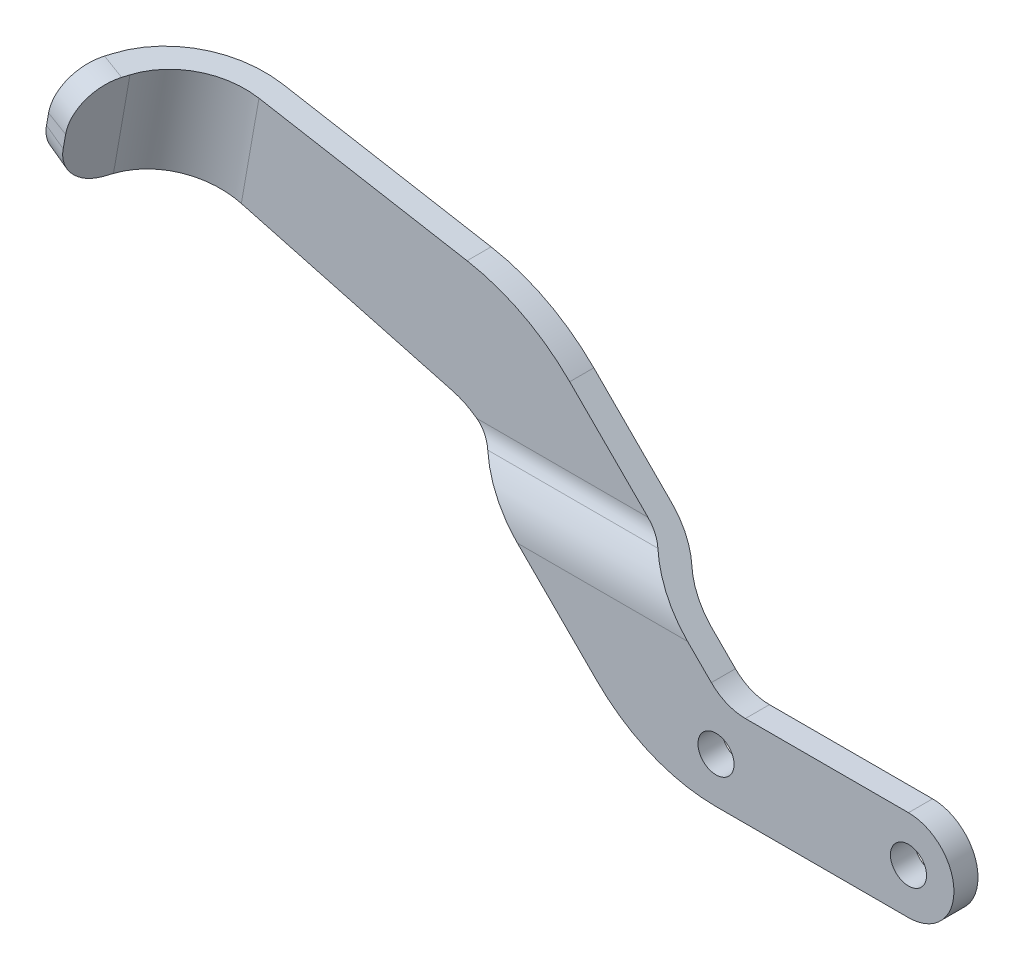
ISO-10303-21;
HEADER;
FILE_DESCRIPTION(('STEP AP214'),'2;1');
FILE_NAME('part.step','',(''),(''),'','','');
FILE_SCHEMA(('AUTOMOTIVE_DESIGN { 1 0 10303 214 1 1 1 1 }'));
ENDSEC;
DATA;
#1=APPLICATION_CONTEXT('core data for automotive mechanical design processes');
#2=APPLICATION_PROTOCOL_DEFINITION('international standard','automotive_design',2000,#1);
#3=PRODUCT_CONTEXT('',#1,'mechanical');
#4=PRODUCT('Part','Part','',(#3));
#5=PRODUCT_RELATED_PRODUCT_CATEGORY('part','',(#4));
#6=PRODUCT_DEFINITION_FORMATION('','',#4);
#7=PRODUCT_DEFINITION_CONTEXT('part definition',#1,'design');
#8=PRODUCT_DEFINITION('design','',#6,#7);
#9=PRODUCT_DEFINITION_SHAPE('','',#8);
#10=(LENGTH_UNIT() NAMED_UNIT(*) SI_UNIT(.MILLI.,.METRE.));
#11=(NAMED_UNIT(*) PLANE_ANGLE_UNIT() SI_UNIT($,.RADIAN.));
#12=(NAMED_UNIT(*) SI_UNIT($,.STERADIAN.) SOLID_ANGLE_UNIT());
#13=UNCERTAINTY_MEASURE_WITH_UNIT(LENGTH_MEASURE(1.E-05),#10,'distance_accuracy_value','');
#14=(GEOMETRIC_REPRESENTATION_CONTEXT(3) GLOBAL_UNCERTAINTY_ASSIGNED_CONTEXT((#13)) GLOBAL_UNIT_ASSIGNED_CONTEXT((#10,
#11,#12)) REPRESENTATION_CONTEXT('',''));
#15=CARTESIAN_POINT('',(0.,0.,0.));
#16=DIRECTION('',(0.,0.,1.));
#17=DIRECTION('',(1.,0.,0.));
#18=AXIS2_PLACEMENT_3D('',#15,#16,#17);
#19=CARTESIAN_POINT('',(-26.0151280605346,7.85987193946543,3.175));
#20=DIRECTION('',(-0.707106781186549,-0.707106781186546,0.));
#21=DIRECTION('',(0.707106781186546,-0.707106781186549,0.));
#22=AXIS2_PLACEMENT_3D('',#19,#20,#21);
#23=PLANE('',#22);
#24=CARTESIAN_POINT('',(-29.1549957084391,10.9997395873699,-6.35));
#25=DIRECTION('',(-0.707106781186549,-0.707106781186546,0.));
#26=DIRECTION('',(0.707106781186546,-0.707106781186549,0.));
#27=AXIS2_PLACEMENT_3D('',#24,#25,#26);
#28=ELLIPSE('',#27,13.4703841816037,9.525);
#29=CARTESIAN_POINT('',(-29.1549957084391,10.9997395873699,3.175));
#30=VERTEX_POINT('',#29);
#31=CARTESIAN_POINT('',(-35.4551910179116,17.2999348968425,0.793750000000002));
#32=VERTEX_POINT('',#31);
#33=EDGE_CURVE('E253',#30,#32,#28,.T.);
#34=ORIENTED_EDGE('',*,*,#33,.F.);
#35=DIRECTION('',(-0.707106781186546,0.707106781186549,0.));
#36=VECTOR('',#35,1.);
#37=CARTESIAN_POINT('',(-26.0151280605346,7.85987193946543,3.175));
#38=LINE('',#37,#36);
#39=CARTESIAN_POINT('',(-26.0151280605346,7.85987193946543,3.175));
#40=VERTEX_POINT('',#39);
#41=EDGE_CURVE('E331',#40,#30,#38,.T.);
#42=ORIENTED_EDGE('',*,*,#41,.F.);
#43=DIRECTION('',(0.,0.,-1.));
#44=VECTOR('',#43,1.);
#45=CARTESIAN_POINT('',(-26.0151280605346,7.85987193946543,3.175));
#46=LINE('',#45,#44);
#47=CARTESIAN_POINT('',(-26.0151280605346,7.85987193946543,0.));
#48=VERTEX_POINT('',#47);
#49=EDGE_CURVE('E363',#40,#48,#46,.T.);
#50=ORIENTED_EDGE('',*,*,#49,.T.);
#51=DIRECTION('',(-0.707106781186546,0.707106781186549,0.));
#52=VECTOR('',#51,1.);
#53=CARTESIAN_POINT('',(-26.0151280605346,7.85987193946543,0.));
#54=LINE('',#53,#52);
#55=CARTESIAN_POINT('',(-29.1549957084391,10.9997395873699,0.));
#56=VERTEX_POINT('',#55);
#57=EDGE_CURVE('E306',#48,#56,#54,.T.);
#58=ORIENTED_EDGE('',*,*,#57,.T.);
#59=CARTESIAN_POINT('',(-29.1549957084391,10.9997395873699,-6.35));
#60=DIRECTION('',(-0.707106781186549,-0.707106781186546,0.));
#61=DIRECTION('',(-0.707106781186546,0.707106781186549,0.));
#62=AXIS2_PLACEMENT_3D('',#59,#60,#61);
#63=ELLIPSE('',#62,8.98025612106914,6.35);
#64=CARTESIAN_POINT('',(-33.3551259147541,15.199869793685,-1.5875));
#65=VERTEX_POINT('',#64);
#66=EDGE_CURVE('E316',#56,#65,#63,.T.);
#67=ORIENTED_EDGE('',*,*,#66,.T.);
#68=CARTESIAN_POINT('',(-37.5552561210691,19.4,3.175));
#69=DIRECTION('',(-0.707106781186549,-0.707106781186546,0.));
#70=DIRECTION('',(-0.707106781186546,0.707106781186549,0.));
#71=AXIS2_PLACEMENT_3D('',#68,#69,#70);
#72=ELLIPSE('',#71,8.98025612106914,6.35);
#73=CARTESIAN_POINT('',(-37.5552561210691,19.4,-3.175));
#74=VERTEX_POINT('',#73);
#75=EDGE_CURVE('E296',#65,#74,#72,.F.);
#76=ORIENTED_EDGE('',*,*,#75,.T.);
#77=DIRECTION('',(-0.707106781186546,0.707106781186549,0.));
#78=VECTOR('',#77,1.);
#79=CARTESIAN_POINT('',(-26.0151280605346,7.85987193946543,-3.175));
#80=LINE('',#79,#78);
#81=CARTESIAN_POINT('',(-47.8835482141741,29.728292093105,-3.175));
#82=VERTEX_POINT('',#81);
#83=EDGE_CURVE('E323',#74,#82,#80,.T.);
#84=ORIENTED_EDGE('',*,*,#83,.T.);
#85=DIRECTION('',(0.,0.,-1.));
#86=VECTOR('',#85,1.);
#87=CARTESIAN_POINT('',(-47.8835482141741,29.728292093105,3.175));
#88=LINE('',#87,#86);
#89=CARTESIAN_POINT('',(-47.8835482141741,29.728292093105,0.));
#90=VERTEX_POINT('',#89);
#91=EDGE_CURVE('E366',#90,#82,#88,.T.);
#92=ORIENTED_EDGE('',*,*,#91,.F.);
#93=DIRECTION('',(0.707106781186546,-0.707106781186549,0.));
#94=VECTOR('',#93,1.);
#95=CARTESIAN_POINT('',(-26.0151280605346,7.85987193946543,0.));
#96=LINE('',#95,#94);
#97=CARTESIAN_POINT('',(-37.5552561210691,19.4,0.));
#98=VERTEX_POINT('',#97);
#99=EDGE_CURVE('E454',#90,#98,#96,.T.);
#100=ORIENTED_EDGE('',*,*,#99,.T.);
#101=CARTESIAN_POINT('',(-37.5552561210691,19.4,3.175));
#102=DIRECTION('',(-0.707106781186549,-0.707106781186546,0.));
#103=DIRECTION('',(0.707106781186546,-0.707106781186549,0.));
#104=AXIS2_PLACEMENT_3D('',#101,#102,#103);
#105=ELLIPSE('',#104,4.49012806053457,3.175);
#106=EDGE_CURVE('E264',#32,#98,#105,.F.);
#107=ORIENTED_EDGE('',*,*,#106,.F.);
#108=EDGE_LOOP('',(#34,#42,#50,#58,#67,#76,#84,#92,#100,#107));
#109=FACE_BOUND('',#108,.T.);
#110=ADVANCED_FACE('F39',(#109),#23,.F.);
#111=CARTESIAN_POINT('',(-65.8440604563124,11.7677798509667,3.175));
#112=DIRECTION('',(0.,0.,-1.));
#113=DIRECTION('',(-1.,0.,0.));
#114=AXIS2_PLACEMENT_3D('',#111,#112,#113);
#115=CYLINDRICAL_SURFACE('',#114,9.52500000000001);
#116=DIRECTION('',(0.,0.,-1.));
#117=VECTOR('',#116,1.);
#118=CARTESIAN_POINT('',(-59.1088683655106,18.5029719417686,3.175));
#119=LINE('',#118,#117);
#120=CARTESIAN_POINT('',(-59.1088683655106,18.5029719417686,0.129352997679215));
#121=VERTEX_POINT('',#120);
#122=CARTESIAN_POINT('',(-59.1088683655106,18.5029719417686,-3.1113217116805));
#123=VERTEX_POINT('',#122);
#124=EDGE_CURVE('E372',#121,#123,#119,.T.);
#125=ORIENTED_EDGE('',*,*,#124,.F.);
#126=CARTESIAN_POINT('',(-59.1088683655106,18.5029719417686,0.129352997679214));
#127=CARTESIAN_POINT('',(-59.1886792418234,18.5828004142644,0.105848736286279));
#128=CARTESIAN_POINT('',(-59.2704318916558,18.6616980958661,0.0860128643272615));
#129=CARTESIAN_POINT('',(-59.4371062268742,18.8168516372428,0.053007404663316));
#130=CARTESIAN_POINT('',(-59.5220143189027,18.893116595117,0.0398121361289758));
#131=CARTESIAN_POINT('',(-59.6948995496534,19.0428422283832,0.0192473264905239));
#132=CARTESIAN_POINT('',(-59.7828761994638,19.1163033466386,0.0118768617102921));
#133=CARTESIAN_POINT('',(-59.9619463224182,19.2604195171152,0.00224620935788169));
#134=CARTESIAN_POINT('',(-60.0530506400862,19.3310624707226,6.12148140675001E-06));
#135=CARTESIAN_POINT('',(-60.1453903836823,19.4,0.));
#136=B_SPLINE_CURVE_WITH_KNOTS('',3,(#126,#127,#128,#129,#130,#131,#132,#133,#134,#135),
.UNSPECIFIED.,.F.,.F.,(4,2,2,2,4),(0.,0.345762616395283,0.690177606879254,1.03453797032589,
1.38024517136542),.UNSPECIFIED.);
#137=CARTESIAN_POINT('',(-60.1453903836823,19.4,0.));
#138=VERTEX_POINT('',#137);
#139=EDGE_CURVE('E255',#121,#138,#136,.T.);
#140=ORIENTED_EDGE('',*,*,#139,.T.);
#141=CARTESIAN_POINT('',(-65.8440604563124,11.7677798509667,0.));
#142=DIRECTION('',(0.,0.,-1.));
#143=DIRECTION('',(-1.,0.,0.));
#144=AXIS2_PLACEMENT_3D('',#141,#142,#143);
#145=CIRCLE('',#144,9.52500000000001);
#146=CARTESIAN_POINT('',(-63.3788090517109,20.9682233463701,0.));
#147=VERTEX_POINT('',#146);
#148=EDGE_CURVE('E390',#147,#138,#145,.T.);
#149=ORIENTED_EDGE('',*,*,#148,.F.);
#150=DIRECTION('',(0.,0.,-1.));
#151=VECTOR('',#150,1.);
#152=CARTESIAN_POINT('',(-63.3788090517109,20.9682233463701,3.175));
#153=LINE('',#152,#151);
#154=CARTESIAN_POINT('',(-63.3788090517109,20.9682233463701,-3.175));
#155=VERTEX_POINT('',#154);
#156=EDGE_CURVE('E370',#147,#155,#153,.T.);
#157=ORIENTED_EDGE('',*,*,#156,.T.);
#158=CARTESIAN_POINT('',(-65.8440604563124,11.7677798509667,-3.175));
#159=DIRECTION('',(0.,0.,1.));
#160=DIRECTION('',(1.,0.,0.));
#161=AXIS2_PLACEMENT_3D('',#158,#159,#160);
#162=CIRCLE('',#161,9.52500000000001);
#163=CARTESIAN_POINT('',(-60.1453903836823,19.4,-3.175));
#164=VERTEX_POINT('',#163);
#165=EDGE_CURVE('E318',#164,#155,#162,.T.);
#166=ORIENTED_EDGE('',*,*,#165,.F.);
#167=CARTESIAN_POINT('',(-59.1088683655106,18.5029719417686,-3.1113217116805));
#168=CARTESIAN_POINT('',(-59.189505151597,18.583613825167,-3.12282841350219));
#169=CARTESIAN_POINT('',(-59.2717146733717,18.6629219050843,-3.13256262496471));
#170=CARTESIAN_POINT('',(-59.4389441454381,18.818532451764,-3.14880457763691));
#171=CARTESIAN_POINT('',(-59.5239583882968,18.8948404041585,-3.15531848630597));
#172=CARTESIAN_POINT('',(-59.6967706565378,19.044421600127,-3.16547983513595));
#173=CARTESIAN_POINT('',(-59.7845685842799,19.1176949499349,-3.16912737572188));
#174=CARTESIAN_POINT('',(-59.9629595247646,19.2612047935532,-3.17388938858678));
#175=CARTESIAN_POINT('',(-60.0535575957453,19.3314351657777,-3.17499896803526));
#176=CARTESIAN_POINT('',(-60.1453903836823,19.4,-3.175));
#177=B_SPLINE_CURVE_WITH_KNOTS('',3,(#167,#168,#169,#170,#171,#172,#173,#174,#175,#176),
.UNSPECIFIED.,.F.,.F.,(4,2,2,2,4),(0.,0.343814559628881,0.686968076684379,1.03010957060628,
1.37391203728518),.UNSPECIFIED.);
#178=EDGE_CURVE('E288',#123,#164,#177,.T.);
#179=ORIENTED_EDGE('',*,*,#178,.F.);
#180=EDGE_LOOP('',(#125,#140,#149,#157,#166,#179));
#181=FACE_BOUND('',#180,.T.);
#182=ADVANCED_FACE('F266',(#181),#115,.F.);
#183=CARTESIAN_POINT('',(-59.1088683655106,18.5029719417686,3.175));
#184=DIRECTION('',(0.707106781186549,0.707106781186546,0.));
#185=DIRECTION('',(-0.707106781186546,0.707106781186549,0.));
#186=AXIS2_PLACEMENT_3D('',#183,#184,#185);
#187=PLANE('',#186);
#188=CARTESIAN_POINT('',(-60.005896423742,19.4,3.175));
#189=DIRECTION('',(0.707106781186549,0.707106781186546,0.));
#190=DIRECTION('',(0.707106781186546,-0.707106781186549,0.));
#191=AXIS2_PLACEMENT_3D('',#188,#189,#190);
#192=ELLIPSE('',#191,4.49012806053456,3.175);
#193=CARTESIAN_POINT('',(-57.9058313205844,17.2999348968425,0.793750000000002));
#194=VERTEX_POINT('',#193);
#195=EDGE_CURVE('E388',#121,#194,#192,.F.);
#196=ORIENTED_EDGE('',*,*,#195,.F.);
#197=ORIENTED_EDGE('',*,*,#124,.T.);
#198=CARTESIAN_POINT('',(-60.005896423742,19.4,3.175));
#199=DIRECTION('',(0.707106781186549,0.707106781186546,0.));
#200=DIRECTION('',(-0.707106781186546,0.707106781186549,0.));
#201=AXIS2_PLACEMENT_3D('',#198,#199,#200);
#202=ELLIPSE('',#201,8.98025612106913,6.35);
#203=CARTESIAN_POINT('',(-55.8057662174269,15.199869793685,-1.5875));
#204=VERTEX_POINT('',#203);
#205=EDGE_CURVE('E297',#123,#204,#202,.F.);
#206=ORIENTED_EDGE('',*,*,#205,.T.);
#207=CARTESIAN_POINT('',(-51.6056360111119,10.9997395873699,-6.35));
#208=DIRECTION('',(0.707106781186549,0.707106781186546,0.));
#209=DIRECTION('',(-0.707106781186546,0.707106781186549,0.));
#210=AXIS2_PLACEMENT_3D('',#207,#208,#209);
#211=ELLIPSE('',#210,8.98025612106913,6.35);
#212=CARTESIAN_POINT('',(-51.6056360111119,10.9997395873699,0.));
#213=VERTEX_POINT('',#212);
#214=EDGE_CURVE('E384',#204,#213,#211,.T.);
#215=ORIENTED_EDGE('',*,*,#214,.T.);
#216=DIRECTION('',(0.707106781186546,-0.707106781186549,0.));
#217=VECTOR('',#216,1.);
#218=CARTESIAN_POINT('',(-59.1088683655106,18.5029719417686,0.));
#219=LINE('',#218,#217);
#220=CARTESIAN_POINT('',(-41.115448211871,0.509551788129007,0.));
#221=VERTEX_POINT('',#220);
#222=EDGE_CURVE('E304',#213,#221,#219,.T.);
#223=ORIENTED_EDGE('',*,*,#222,.T.);
#224=DIRECTION('',(0.,0.,-1.));
#225=VECTOR('',#224,1.);
#226=CARTESIAN_POINT('',(-41.115448211871,0.509551788129007,3.175));
#227=LINE('',#226,#225);
#228=CARTESIAN_POINT('',(-41.115448211871,0.509551788129007,3.175));
#229=VERTEX_POINT('',#228);
#230=EDGE_CURVE('E374',#229,#221,#227,.T.);
#231=ORIENTED_EDGE('',*,*,#230,.F.);
#232=DIRECTION('',(0.707106781186546,-0.707106781186549,0.));
#233=VECTOR('',#232,1.);
#234=CARTESIAN_POINT('',(-59.1088683655106,18.5029719417686,3.175));
#235=LINE('',#234,#233);
#236=CARTESIAN_POINT('',(-51.6056360111119,10.9997395873699,3.175));
#237=VERTEX_POINT('',#236);
#238=EDGE_CURVE('E329',#237,#229,#235,.T.);
#239=ORIENTED_EDGE('',*,*,#238,.F.);
#240=CARTESIAN_POINT('',(-51.6056360111119,10.9997395873699,-6.35));
#241=DIRECTION('',(0.707106781186549,0.707106781186546,0.));
#242=DIRECTION('',(0.707106781186546,-0.707106781186549,0.));
#243=AXIS2_PLACEMENT_3D('',#240,#241,#242);
#244=ELLIPSE('',#243,13.4703841816037,9.525);
#245=EDGE_CURVE('E251',#194,#237,#244,.T.);
#246=ORIENTED_EDGE('',*,*,#245,.F.);
#247=EDGE_LOOP('',(#196,#197,#206,#215,#223,#231,#239,#246));
#248=FACE_BOUND('',#247,.T.);
#249=ADVANCED_FACE('F481',(#248),#187,.F.);
#250=CARTESIAN_POINT('',(0.,0.,3.175));
#251=DIRECTION('',(0.,0.,-1.));
#252=DIRECTION('',(-1.,0.,0.));
#253=AXIS2_PLACEMENT_3D('',#250,#251,#252);
#254=PLANE('',#253);
#255=CARTESIAN_POINT('',(-25.4,0.,3.175));
#256=DIRECTION('',(0.,0.,1.));
#257=DIRECTION('',(1.,0.,0.));
#258=AXIS2_PLACEMENT_3D('',#255,#256,#257);
#259=CIRCLE('',#258,2.38125);
#260=CARTESIAN_POINT('',(-23.01875,0.,3.175));
#261=VERTEX_POINT('',#260);
#262=EDGE_CURVE('E223',#261,#261,#259,.T.);
#263=ORIENTED_EDGE('',*,*,#262,.F.);
#264=EDGE_LOOP('',(#263));
#265=FACE_BOUND('',#264,.T.);
#266=CARTESIAN_POINT('',(0.,0.,3.175));
#267=DIRECTION('',(0.,0.,1.));
#268=DIRECTION('',(1.,0.,0.));
#269=AXIS2_PLACEMENT_3D('',#266,#267,#268);
#270=CIRCLE('',#269,2.38125);
#271=CARTESIAN_POINT('',(2.38125,0.,3.175));
#272=VERTEX_POINT('',#271);
#273=EDGE_CURVE('E241',#272,#272,#270,.T.);
#274=ORIENTED_EDGE('',*,*,#273,.F.);
#275=EDGE_LOOP('',(#274));
#276=FACE_BOUND('',#275,.T.);
#277=DIRECTION('',(1.,0.,0.));
#278=VECTOR('',#277,1.);
#279=CARTESIAN_POINT('',(-91.2266301851405,10.9997395873699,3.175));
#280=LINE('',#279,#278);
#281=EDGE_CURVE('E386',#237,#30,#280,.T.);
#282=ORIENTED_EDGE('',*,*,#281,.F.);
#283=ORIENTED_EDGE('',*,*,#238,.T.);
#284=CARTESIAN_POINT('',(-25.4,16.225,3.175));
#285=DIRECTION('',(0.,0.,-1.));
#286=DIRECTION('',(-1.,0.,0.));
#287=AXIS2_PLACEMENT_3D('',#284,#285,#286);
#288=CIRCLE('',#287,22.225);
#289=CARTESIAN_POINT('',(-25.4,-6.,3.175));
#290=VERTEX_POINT('',#289);
#291=EDGE_CURVE('E326',#290,#229,#288,.T.);
#292=ORIENTED_EDGE('',*,*,#291,.F.);
#293=DIRECTION('',(-1.,0.,0.));
#294=VECTOR('',#293,1.);
#295=CARTESIAN_POINT('',(0.,-6.,3.175));
#296=LINE('',#295,#294);
#297=CARTESIAN_POINT('',(0.,-6.,3.175));
#298=VERTEX_POINT('',#297);
#299=EDGE_CURVE('E322',#298,#290,#296,.T.);
#300=ORIENTED_EDGE('',*,*,#299,.F.);
#301=CARTESIAN_POINT('',(0.,0.,3.175));
#302=DIRECTION('',(0.,0.,-1.));
#303=DIRECTION('',(-1.,0.,0.));
#304=AXIS2_PLACEMENT_3D('',#301,#302,#303);
#305=CIRCLE('',#304,6.);
#306=CARTESIAN_POINT('',(0.,6.,3.175));
#307=VERTEX_POINT('',#306);
#308=EDGE_CURVE('E319',#307,#298,#305,.T.);
#309=ORIENTED_EDGE('',*,*,#308,.F.);
#310=DIRECTION('',(-1.,0.,0.));
#311=VECTOR('',#310,1.);
#312=CARTESIAN_POINT('',(0.,6.,3.175));
#313=LINE('',#312,#311);
#314=CARTESIAN_POINT('',(-21.525,6.,3.175));
#315=VERTEX_POINT('',#314);
#316=EDGE_CURVE('E337',#307,#315,#313,.T.);
#317=ORIENTED_EDGE('',*,*,#316,.T.);
#318=CARTESIAN_POINT('',(-21.525,12.35,3.175));
#319=DIRECTION('',(0.,0.,1.));
#320=DIRECTION('',(1.,0.,0.));
#321=AXIS2_PLACEMENT_3D('',#318,#319,#320);
#322=CIRCLE('',#321,6.35);
#323=EDGE_CURVE('E334',#40,#315,#322,.T.);
#324=ORIENTED_EDGE('',*,*,#323,.F.);
#325=ORIENTED_EDGE('',*,*,#41,.T.);
#326=EDGE_LOOP('',(#282,#283,#292,#300,#309,#317,#324,#325));
#327=FACE_BOUND('',#326,.T.);
#328=ADVANCED_FACE('F494',(#265,#276,#327),#254,.F.);
#329=CARTESIAN_POINT('',(0.,0.,3.175));
#330=DIRECTION('',(0.,0.,-1.));
#331=DIRECTION('',(-1.,0.,0.));
#332=AXIS2_PLACEMENT_3D('',#329,#330,#331);
#333=CYLINDRICAL_SURFACE('',#332,6.);
#334=CARTESIAN_POINT('',(0.,0.,0.));
#335=DIRECTION('',(0.,0.,1.));
#336=DIRECTION('',(1.,0.,0.));
#337=AXIS2_PLACEMENT_3D('',#334,#335,#336);
#338=CIRCLE('',#337,6.);
#339=CARTESIAN_POINT('',(0.,6.,0.));
#340=VERTEX_POINT('',#339);
#341=CARTESIAN_POINT('',(0.,-6.,0.));
#342=VERTEX_POINT('',#341);
#343=EDGE_CURVE('E313',#340,#342,#338,.F.);
#344=ORIENTED_EDGE('',*,*,#343,.F.);
#345=DIRECTION('',(0.,0.,-1.));
#346=VECTOR('',#345,1.);
#347=CARTESIAN_POINT('',(0.,6.,3.175));
#348=LINE('',#347,#346);
#349=EDGE_CURVE('E356',#307,#340,#348,.T.);
#350=ORIENTED_EDGE('',*,*,#349,.F.);
#351=ORIENTED_EDGE('',*,*,#308,.T.);
#352=DIRECTION('',(0.,0.,-1.));
#353=VECTOR('',#352,1.);
#354=CARTESIAN_POINT('',(0.,-6.,3.175));
#355=LINE('',#354,#353);
#356=EDGE_CURVE('E339',#298,#342,#355,.T.);
#357=ORIENTED_EDGE('',*,*,#356,.T.);
#358=EDGE_LOOP('',(#344,#350,#351,#357));
#359=FACE_BOUND('',#358,.T.);
#360=ADVANCED_FACE('F496',(#359),#333,.T.);
#361=CARTESIAN_POINT('',(0.,6.,3.175));
#362=DIRECTION('',(0.,-1.,0.));
#363=DIRECTION('',(1.,0.,0.));
#364=AXIS2_PLACEMENT_3D('',#361,#362,#363);
#365=PLANE('',#364);
#366=ORIENTED_EDGE('',*,*,#349,.T.);
#367=DIRECTION('',(-1.,0.,0.));
#368=VECTOR('',#367,1.);
#369=CARTESIAN_POINT('',(0.,6.,0.));
#370=LINE('',#369,#368);
#371=CARTESIAN_POINT('',(-21.525,6.,0.));
#372=VERTEX_POINT('',#371);
#373=EDGE_CURVE('E311',#340,#372,#370,.T.);
#374=ORIENTED_EDGE('',*,*,#373,.T.);
#375=DIRECTION('',(0.,0.,-1.));
#376=VECTOR('',#375,1.);
#377=CARTESIAN_POINT('',(-21.525,6.,3.175));
#378=LINE('',#377,#376);
#379=EDGE_CURVE('E360',#315,#372,#378,.T.);
#380=ORIENTED_EDGE('',*,*,#379,.F.);
#381=ORIENTED_EDGE('',*,*,#316,.F.);
#382=EDGE_LOOP('',(#366,#374,#380,#381));
#383=FACE_BOUND('',#382,.T.);
#384=ADVANCED_FACE('F500',(#383),#365,.F.);
#385=CARTESIAN_POINT('',(-21.525,12.35,3.175));
#386=DIRECTION('',(0.,0.,-1.));
#387=DIRECTION('',(-1.,0.,0.));
#388=AXIS2_PLACEMENT_3D('',#385,#386,#387);
#389=CYLINDRICAL_SURFACE('',#388,6.35);
#390=CARTESIAN_POINT('',(-21.525,12.35,0.));
#391=DIRECTION('',(0.,0.,1.));
#392=DIRECTION('',(1.,0.,0.));
#393=AXIS2_PLACEMENT_3D('',#390,#391,#392);
#394=CIRCLE('',#393,6.35);
#395=EDGE_CURVE('E308',#48,#372,#394,.T.);
#396=ORIENTED_EDGE('',*,*,#395,.F.);
#397=ORIENTED_EDGE('',*,*,#49,.F.);
#398=ORIENTED_EDGE('',*,*,#323,.T.);
#399=ORIENTED_EDGE('',*,*,#379,.T.);
#400=EDGE_LOOP('',(#396,#397,#398,#399));
#401=FACE_BOUND('',#400,.T.);
#402=ADVANCED_FACE('F504',(#401),#389,.F.);
#403=CARTESIAN_POINT('',(-65.8440604563124,11.7677798509667,3.175));
#404=DIRECTION('',(0.,0.,-1.));
#405=DIRECTION('',(-1.,0.,0.));
#406=AXIS2_PLACEMENT_3D('',#403,#404,#405);
#407=CYLINDRICAL_SURFACE('',#406,25.4);
#408=DIRECTION('',(0.,0.,-1.));
#409=VECTOR('',#408,1.);
#410=CARTESIAN_POINT('',(-61.4333967435724,36.7818967774768,3.175));
#411=LINE('',#410,#409);
#412=CARTESIAN_POINT('',(-61.4333967435724,36.7818967774768,0.));
#413=VERTEX_POINT('',#412);
#414=CARTESIAN_POINT('',(-61.4333967435724,36.7818967774768,-3.175));
#415=VERTEX_POINT('',#414);
#416=EDGE_CURVE('E368',#413,#415,#411,.T.);
#417=ORIENTED_EDGE('',*,*,#416,.F.);
#418=CARTESIAN_POINT('',(-65.8440604563124,11.7677798509667,0.));
#419=DIRECTION('',(0.,0.,-1.));
#420=DIRECTION('',(-1.,0.,0.));
#421=AXIS2_PLACEMENT_3D('',#418,#419,#420);
#422=CIRCLE('',#421,25.4);
#423=EDGE_CURVE('E457',#413,#90,#422,.T.);
#424=ORIENTED_EDGE('',*,*,#423,.T.);
#425=ORIENTED_EDGE('',*,*,#91,.T.);
#426=CARTESIAN_POINT('',(-65.8440604563124,11.7677798509667,-3.175));
#427=DIRECTION('',(0.,0.,1.));
#428=DIRECTION('',(1.,0.,0.));
#429=AXIS2_PLACEMENT_3D('',#426,#427,#428);
#430=CIRCLE('',#429,25.4);
#431=EDGE_CURVE('E351',#82,#415,#430,.T.);
#432=ORIENTED_EDGE('',*,*,#431,.T.);
#433=EDGE_LOOP('',(#417,#424,#425,#432));
#434=FACE_BOUND('',#433,.T.);
#435=ADVANCED_FACE('F474',(#434),#407,.T.);
#436=CARTESIAN_POINT('',(-61.4333967435724,36.7818967774768,3.175));
#437=DIRECTION('',(-0.17364817766693,-0.984807753012208,0.));
#438=DIRECTION('',(0.984807753012208,-0.17364817766693,0.));
#439=AXIS2_PLACEMENT_3D('',#436,#437,#438);
#440=PLANE('',#439);
#441=DIRECTION('',(-0.241580615484602,0.0425971805260925,0.969445349895139));
#442=VECTOR('',#441,1.);
#443=CARTESIAN_POINT('',(-101.437156596784,43.8356389693801,6.73547247011678));
#444=LINE('',#443,#442);
#445=CARTESIAN_POINT('',(-101.437156596784,43.8356389693801,6.73547247011678));
#446=VERTEX_POINT('',#445);
#447=CARTESIAN_POINT('',(-101.658057911583,43.8745898312532,7.6219332980609));
#448=VERTEX_POINT('',#447);
#449=EDGE_CURVE('E229',#446,#448,#444,.T.);
#450=ORIENTED_EDGE('',*,*,#449,.T.);
#451=DIRECTION('',(0.954717296698367,-0.168342418356971,0.245307385878799));
#452=VECTOR('',#451,1.);
#453=CARTESIAN_POINT('',(-98.6268304945654,43.3401026529698,8.40078424822608));
#454=LINE('',#453,#452);
#455=CARTESIAN_POINT('',(-98.6268304945654,43.3401026529698,8.40078424822609));
#456=VERTEX_POINT('',#455);
#457=EDGE_CURVE('E392',#448,#456,#454,.T.);
#458=ORIENTED_EDGE('',*,*,#457,.T.);
#459=DIRECTION('',(0.241580615484602,-0.0425971805260914,-0.969445349895139));
#460=VECTOR('',#459,1.);
#461=CARTESIAN_POINT('',(-99.9154214975603,43.567316013896,13.5718057445668));
#462=LINE('',#461,#460);
#463=CARTESIAN_POINT('',(-98.4059291797663,43.3011517910967,7.51432342028197));
#464=VERTEX_POINT('',#463);
#465=EDGE_CURVE('E224',#456,#464,#462,.T.);
#466=ORIENTED_EDGE('',*,*,#465,.T.);
#467=CARTESIAN_POINT('',(-88.9,41.625,9.9568));
#468=DIRECTION('',(0.17364817766693,0.984807753012208,0.));
#469=DIRECTION('',(-0.984807753012208,0.17364817766693,0.));
#470=AXIS2_PLACEMENT_3D('',#467,#468,#469);
#471=CIRCLE('',#470,9.95679999999999);
#472=CARTESIAN_POINT('',(-88.9,41.625,0.));
#473=VERTEX_POINT('',#472);
#474=EDGE_CURVE('E210',#473,#464,#471,.T.);
#475=ORIENTED_EDGE('',*,*,#474,.F.);
#476=DIRECTION('',(0.984807753012208,-0.17364817766693,0.));
#477=VECTOR('',#476,1.);
#478=CARTESIAN_POINT('',(-61.4333967435724,36.7818967774768,0.));
#479=LINE('',#478,#477);
#480=EDGE_CURVE('E460',#473,#413,#479,.T.);
#481=ORIENTED_EDGE('',*,*,#480,.T.);
#482=ORIENTED_EDGE('',*,*,#416,.T.);
#483=DIRECTION('',(-0.984807753012208,0.17364817766693,0.));
#484=VECTOR('',#483,1.);
#485=CARTESIAN_POINT('',(-61.4333967435724,36.7818967774768,-3.175));
#486=LINE('',#485,#484);
#487=CARTESIAN_POINT('',(-88.9,41.625,-3.175));
#488=VERTEX_POINT('',#487);
#489=EDGE_CURVE('E348',#415,#488,#486,.T.);
#490=ORIENTED_EDGE('',*,*,#489,.T.);
#491=CARTESIAN_POINT('',(-88.9,41.625,9.9568));
#492=DIRECTION('',(0.17364817766693,0.984807753012208,0.));
#493=DIRECTION('',(-0.984807753012208,0.17364817766693,0.));
#494=AXIS2_PLACEMENT_3D('',#491,#492,#493);
#495=CIRCLE('',#494,13.1318);
#496=EDGE_CURVE('E239',#488,#446,#495,.T.);
#497=ORIENTED_EDGE('',*,*,#496,.T.);
#498=EDGE_LOOP('',(#450,#458,#466,#475,#481,#482,#490,#497));
#499=FACE_BOUND('',#498,.T.);
#500=ADVANCED_FACE('F417',(#499),#440,.F.);
#501=CARTESIAN_POINT('',(-63.3788090517109,20.9682233463701,3.175));
#502=DIRECTION('',(-0.258819045102521,-0.965925826289068,0.));
#503=DIRECTION('',(0.965925826289068,-0.258819045102521,0.));
#504=AXIS2_PLACEMENT_3D('',#501,#502,#503);
#505=PLANE('',#504);
#506=DIRECTION('',(0.237799086154686,-0.0637180730960073,-0.969222163275752));
#507=VECTOR('',#506,1.);
#508=CARTESIAN_POINT('',(-101.957856591592,31.3054479794431,13.1060863516145));
#509=LINE('',#508,#507);
#510=CARTESIAN_POINT('',(-100.830533645396,31.0033827064008,8.51134041591392));
#511=VERTEX_POINT('',#510);
#512=CARTESIAN_POINT('',(-100.585915084837,30.9378373606455,7.51432342028197));
#513=VERTEX_POINT('',#512);
#514=EDGE_CURVE('E201',#511,#513,#509,.T.);
#515=ORIENTED_EDGE('',*,*,#514,.F.);
#516=DIRECTION('',(0.936626392077294,-0.250968285366787,0.244429788291702));
#517=VECTOR('',#516,1.);
#518=CARTESIAN_POINT('',(-66.8380953692562,21.8951363215444,17.3822889196476));
#519=LINE('',#518,#517);
#520=CARTESIAN_POINT('',(-103.814999493513,31.8030679202422,7.73248946574873));
#521=VERTEX_POINT('',#520);
#522=EDGE_CURVE('E11',#511,#521,#519,.F.);
#523=ORIENTED_EDGE('',*,*,#522,.T.);
#524=DIRECTION('',(-0.237799086154687,0.0637180730960074,0.969222163275752));
#525=VECTOR('',#524,1.);
#526=CARTESIAN_POINT('',(-103.455426691861,31.7067206784192,6.2669416610528));
#527=LINE('',#526,#525);
#528=CARTESIAN_POINT('',(-103.570380932955,31.7375225744868,6.73547247011678));
#529=VERTEX_POINT('',#528);
#530=EDGE_CURVE('E234',#529,#521,#527,.T.);
#531=ORIENTED_EDGE('',*,*,#530,.F.);
#532=CARTESIAN_POINT('',(-91.2266301851405,28.4300245300389,9.9568));
#533=DIRECTION('',(-0.258819045102521,-0.965925826289068,0.));
#534=DIRECTION('',(-0.965925826289068,0.258819045102521,0.));
#535=AXIS2_PLACEMENT_3D('',#532,#533,#534);
#536=ELLIPSE('',#535,13.1819613426517,13.1318);
#537=CARTESIAN_POINT('',(-91.2266301851405,28.4300245300389,-3.175));
#538=VERTEX_POINT('',#537);
#539=EDGE_CURVE('E237',#538,#529,#536,.F.);
#540=ORIENTED_EDGE('',*,*,#539,.F.);
#541=DIRECTION('',(-0.965925826289068,0.258819045102521,0.));
#542=VECTOR('',#541,1.);
#543=CARTESIAN_POINT('',(-63.3788090517109,20.9682233463701,-3.175));
#544=LINE('',#543,#542);
#545=EDGE_CURVE('E342',#155,#538,#544,.T.);
#546=ORIENTED_EDGE('',*,*,#545,.F.);
#547=ORIENTED_EDGE('',*,*,#156,.F.);
#548=DIRECTION('',(0.965925826289068,-0.258819045102521,0.));
#549=VECTOR('',#548,1.);
#550=CARTESIAN_POINT('',(-63.3788090517109,20.9682233463701,0.));
#551=LINE('',#550,#549);
#552=CARTESIAN_POINT('',(-91.2266301851405,28.4300245300389,0.));
#553=VERTEX_POINT('',#552);
#554=EDGE_CURVE('E222',#553,#147,#551,.T.);
#555=ORIENTED_EDGE('',*,*,#554,.F.);
#556=CARTESIAN_POINT('',(-91.2266301851405,28.4300245300389,9.9568));
#557=DIRECTION('',(-0.258819045102521,-0.965925826289068,0.));
#558=DIRECTION('',(-0.965925826289068,0.258819045102521,0.));
#559=AXIS2_PLACEMENT_3D('',#556,#557,#558);
#560=ELLIPSE('',#559,9.9948333584516,9.95679999999999);
#561=EDGE_CURVE('E214',#553,#513,#560,.F.);
#562=ORIENTED_EDGE('',*,*,#561,.T.);
#563=EDGE_LOOP('',(#515,#523,#531,#540,#546,#547,#555,#562));
#564=FACE_BOUND('',#563,.T.);
#565=ADVANCED_FACE('F220',(#564),#505,.T.);
#566=CARTESIAN_POINT('',(-25.4,16.225,3.175));
#567=DIRECTION('',(0.,0.,-1.));
#568=DIRECTION('',(-1.,0.,0.));
#569=AXIS2_PLACEMENT_3D('',#566,#567,#568);
#570=CYLINDRICAL_SURFACE('',#569,22.225);
#571=CARTESIAN_POINT('',(-25.4,16.225,0.));
#572=DIRECTION('',(0.,0.,1.));
#573=DIRECTION('',(1.,0.,0.));
#574=AXIS2_PLACEMENT_3D('',#571,#572,#573);
#575=CIRCLE('',#574,22.225);
#576=CARTESIAN_POINT('',(-25.4,-6.,0.));
#577=VERTEX_POINT('',#576);
#578=EDGE_CURVE('E301',#577,#221,#575,.F.);
#579=ORIENTED_EDGE('',*,*,#578,.F.);
#580=DIRECTION('',(0.,0.,-1.));
#581=VECTOR('',#580,1.);
#582=CARTESIAN_POINT('',(-25.4,-6.,3.175));
#583=LINE('',#582,#581);
#584=EDGE_CURVE('E377',#290,#577,#583,.T.);
#585=ORIENTED_EDGE('',*,*,#584,.F.);
#586=ORIENTED_EDGE('',*,*,#291,.T.);
#587=ORIENTED_EDGE('',*,*,#230,.T.);
#588=EDGE_LOOP('',(#579,#585,#586,#587));
#589=FACE_BOUND('',#588,.T.);
#590=ADVANCED_FACE('F486',(#589),#570,.T.);
#591=CARTESIAN_POINT('',(0.,-6.,3.175));
#592=DIRECTION('',(0.,-1.,0.));
#593=DIRECTION('',(1.,0.,0.));
#594=AXIS2_PLACEMENT_3D('',#591,#592,#593);
#595=PLANE('',#594);
#596=DIRECTION('',(-1.,0.,0.));
#597=VECTOR('',#596,1.);
#598=CARTESIAN_POINT('',(135.562950910719,-6.,0.));
#599=LINE('',#598,#597);
#600=EDGE_CURVE('E446',#342,#577,#599,.T.);
#601=ORIENTED_EDGE('',*,*,#600,.F.);
#602=ORIENTED_EDGE('',*,*,#356,.F.);
#603=ORIENTED_EDGE('',*,*,#299,.T.);
#604=ORIENTED_EDGE('',*,*,#584,.T.);
#605=EDGE_LOOP('',(#601,#602,#603,#604));
#606=FACE_BOUND('',#605,.T.);
#607=ADVANCED_FACE('F489',(#606),#595,.T.);
#608=CARTESIAN_POINT('',(0.,0.,-3.175));
#609=DIRECTION('',(0.,0.,-1.));
#610=DIRECTION('',(-1.,0.,0.));
#611=AXIS2_PLACEMENT_3D('',#608,#609,#610);
#612=PLANE('',#611);
#613=DIRECTION('',(-1.,0.,0.));
#614=VECTOR('',#613,1.);
#615=CARTESIAN_POINT('',(135.562950910719,19.4,-3.175));
#616=LINE('',#615,#614);
#617=EDGE_CURVE('E359',#164,#74,#616,.F.);
#618=ORIENTED_EDGE('',*,*,#617,.F.);
#619=ORIENTED_EDGE('',*,*,#165,.T.);
#620=ORIENTED_EDGE('',*,*,#545,.T.);
#621=DIRECTION('',(0.173648177666931,0.984807753012208,0.));
#622=VECTOR('',#621,1.);
#623=CARTESIAN_POINT('',(-91.2266301851405,28.4300245300389,-3.175));
#624=LINE('',#623,#622);
#625=EDGE_CURVE('E345',#538,#488,#624,.T.);
#626=ORIENTED_EDGE('',*,*,#625,.T.);
#627=ORIENTED_EDGE('',*,*,#489,.F.);
#628=ORIENTED_EDGE('',*,*,#431,.F.);
#629=ORIENTED_EDGE('',*,*,#83,.F.);
#630=EDGE_LOOP('',(#618,#619,#620,#626,#627,#628,#629));
#631=FACE_BOUND('',#630,.T.);
#632=ADVANCED_FACE('F432',(#631),#612,.T.);
#633=CARTESIAN_POINT('',(135.562950910719,10.9997395873699,-6.35));
#634=DIRECTION('',(-1.,0.,0.));
#635=DIRECTION('',(0.,0.,1.));
#636=AXIS2_PLACEMENT_3D('',#633,#634,#635);
#637=CYLINDRICAL_SURFACE('',#636,6.35);
#638=ORIENTED_EDGE('',*,*,#66,.F.);
#639=DIRECTION('',(-1.,0.,0.));
#640=VECTOR('',#639,1.);
#641=CARTESIAN_POINT('',(135.562950910719,10.9997395873699,0.));
#642=LINE('',#641,#640);
#643=EDGE_CURVE('E448',#56,#213,#642,.T.);
#644=ORIENTED_EDGE('',*,*,#643,.T.);
#645=ORIENTED_EDGE('',*,*,#214,.F.);
#646=DIRECTION('',(-1.,0.,0.));
#647=VECTOR('',#646,1.);
#648=CARTESIAN_POINT('',(135.562950910719,15.199869793685,-1.5875));
#649=LINE('',#648,#647);
#650=EDGE_CURVE('E443',#65,#204,#649,.T.);
#651=ORIENTED_EDGE('',*,*,#650,.F.);
#652=EDGE_LOOP('',(#638,#644,#645,#651));
#653=FACE_BOUND('',#652,.T.);
#654=ADVANCED_FACE('F285',(#653),#637,.F.);
#655=CARTESIAN_POINT('',(135.562950910719,-6.,0.));
#656=DIRECTION('',(0.,0.,1.));
#657=DIRECTION('',(1.,0.,0.));
#658=AXIS2_PLACEMENT_3D('',#655,#656,#657);
#659=PLANE('',#658);
#660=CARTESIAN_POINT('',(-25.4,0.,0.));
#661=DIRECTION('',(0.,0.,1.));
#662=DIRECTION('',(1.,0.,0.));
#663=AXIS2_PLACEMENT_3D('',#660,#661,#662);
#664=CIRCLE('',#663,2.38125);
#665=CARTESIAN_POINT('',(-23.01875,0.,0.));
#666=VERTEX_POINT('',#665);
#667=EDGE_CURVE('E227',#666,#666,#664,.T.);
#668=ORIENTED_EDGE('',*,*,#667,.T.);
#669=EDGE_LOOP('',(#668));
#670=FACE_BOUND('',#669,.T.);
#671=CARTESIAN_POINT('',(0.,0.,0.));
#672=DIRECTION('',(0.,0.,1.));
#673=DIRECTION('',(1.,0.,0.));
#674=AXIS2_PLACEMENT_3D('',#671,#672,#673);
#675=CIRCLE('',#674,2.38125);
#676=CARTESIAN_POINT('',(2.38125,0.,0.));
#677=VERTEX_POINT('',#676);
#678=EDGE_CURVE('E244',#677,#677,#675,.T.);
#679=ORIENTED_EDGE('',*,*,#678,.T.);
#680=EDGE_LOOP('',(#679));
#681=FACE_BOUND('',#680,.T.);
#682=ORIENTED_EDGE('',*,*,#373,.F.);
#683=ORIENTED_EDGE('',*,*,#343,.T.);
#684=ORIENTED_EDGE('',*,*,#600,.T.);
#685=ORIENTED_EDGE('',*,*,#578,.T.);
#686=ORIENTED_EDGE('',*,*,#222,.F.);
#687=ORIENTED_EDGE('',*,*,#643,.F.);
#688=ORIENTED_EDGE('',*,*,#57,.F.);
#689=ORIENTED_EDGE('',*,*,#395,.T.);
#690=EDGE_LOOP('',(#682,#683,#684,#685,#686,#687,#688,#689));
#691=FACE_BOUND('',#690,.T.);
#692=ADVANCED_FACE('F283',(#670,#681,#691),#659,.F.);
#693=CARTESIAN_POINT('',(135.562950910719,19.4,3.175));
#694=DIRECTION('',(-1.,0.,0.));
#695=DIRECTION('',(0.,0.,1.));
#696=AXIS2_PLACEMENT_3D('',#693,#694,#695);
#697=CYLINDRICAL_SURFACE('',#696,6.35);
#698=ORIENTED_EDGE('',*,*,#75,.F.);
#699=ORIENTED_EDGE('',*,*,#650,.T.);
#700=ORIENTED_EDGE('',*,*,#205,.F.);
#701=ORIENTED_EDGE('',*,*,#178,.T.);
#702=ORIENTED_EDGE('',*,*,#617,.T.);
#703=EDGE_LOOP('',(#698,#699,#700,#701,#702));
#704=FACE_BOUND('',#703,.T.);
#705=ADVANCED_FACE('F279',(#704),#697,.T.);
#706=CARTESIAN_POINT('',(-91.2266301851405,19.4,0.));
#707=DIRECTION('',(0.,0.,-1.));
#708=DIRECTION('',(-1.,0.,0.));
#709=AXIS2_PLACEMENT_3D('',#706,#707,#708);
#710=PLANE('',#709);
#711=ORIENTED_EDGE('',*,*,#423,.F.);
#712=ORIENTED_EDGE('',*,*,#480,.F.);
#713=DIRECTION('',(-0.173648177666931,-0.984807753012208,0.));
#714=VECTOR('',#713,1.);
#715=CARTESIAN_POINT('',(-91.2266301851405,28.4300245300389,0.));
#716=LINE('',#715,#714);
#717=EDGE_CURVE('E463',#473,#553,#716,.T.);
#718=ORIENTED_EDGE('',*,*,#717,.T.);
#719=ORIENTED_EDGE('',*,*,#554,.T.);
#720=ORIENTED_EDGE('',*,*,#148,.T.);
#721=DIRECTION('',(1.,0.,0.));
#722=VECTOR('',#721,1.);
#723=CARTESIAN_POINT('',(-91.2266301851405,19.4,0.));
#724=LINE('',#723,#722);
#725=EDGE_CURVE('E245',#138,#98,#724,.T.);
#726=ORIENTED_EDGE('',*,*,#725,.T.);
#727=ORIENTED_EDGE('',*,*,#99,.F.);
#728=EDGE_LOOP('',(#711,#712,#718,#719,#720,#726,#727));
#729=FACE_BOUND('',#728,.T.);
#730=ADVANCED_FACE('F276',(#729),#710,.F.);
#731=CARTESIAN_POINT('',(-91.2266301851405,19.4,3.175));
#732=DIRECTION('',(1.,0.,0.));
#733=DIRECTION('',(0.,0.,-1.));
#734=AXIS2_PLACEMENT_3D('',#731,#732,#733);
#735=CYLINDRICAL_SURFACE('',#734,3.175);
#736=ORIENTED_EDGE('',*,*,#106,.T.);
#737=ORIENTED_EDGE('',*,*,#725,.F.);
#738=ORIENTED_EDGE('',*,*,#139,.F.);
#739=ORIENTED_EDGE('',*,*,#195,.T.);
#740=DIRECTION('',(1.,0.,0.));
#741=VECTOR('',#740,1.);
#742=CARTESIAN_POINT('',(-91.2266301851405,17.2999348968425,0.793750000000002));
#743=LINE('',#742,#741);
#744=EDGE_CURVE('E248',#194,#32,#743,.T.);
#745=ORIENTED_EDGE('',*,*,#744,.T.);
#746=EDGE_LOOP('',(#736,#737,#738,#739,#745));
#747=FACE_BOUND('',#746,.T.);
#748=ADVANCED_FACE('F270',(#747),#735,.F.);
#749=CARTESIAN_POINT('',(-91.2266301851405,10.9997395873699,-6.35));
#750=DIRECTION('',(1.,0.,0.));
#751=DIRECTION('',(0.,0.,-1.));
#752=AXIS2_PLACEMENT_3D('',#749,#750,#751);
#753=CYLINDRICAL_SURFACE('',#752,9.525);
#754=ORIENTED_EDGE('',*,*,#33,.T.);
#755=ORIENTED_EDGE('',*,*,#744,.F.);
#756=ORIENTED_EDGE('',*,*,#245,.T.);
#757=ORIENTED_EDGE('',*,*,#281,.T.);
#758=EDGE_LOOP('',(#754,#755,#756,#757));
#759=FACE_BOUND('',#758,.T.);
#760=ADVANCED_FACE('F275',(#759),#753,.T.);
#761=CARTESIAN_POINT('',(0.,0.,-3.175));
#762=DIRECTION('',(0.,0.,1.));
#763=DIRECTION('',(1.,0.,0.));
#764=AXIS2_PLACEMENT_3D('',#761,#762,#763);
#765=CYLINDRICAL_SURFACE('',#764,2.38125);
#766=ORIENTED_EDGE('',*,*,#273,.T.);
#767=EDGE_LOOP('',(#766));
#768=FACE_BOUND('',#767,.T.);
#769=ORIENTED_EDGE('',*,*,#678,.F.);
#770=EDGE_LOOP('',(#769));
#771=FACE_BOUND('',#770,.T.);
#772=ADVANCED_FACE('F509',(#768,#771),#765,.F.);
#773=CARTESIAN_POINT('',(-25.4,0.,-3.175));
#774=DIRECTION('',(0.,0.,1.));
#775=DIRECTION('',(1.,0.,0.));
#776=AXIS2_PLACEMENT_3D('',#773,#774,#775);
#777=CYLINDRICAL_SURFACE('',#776,2.38125);
#778=ORIENTED_EDGE('',*,*,#262,.T.);
#779=EDGE_LOOP('',(#778));
#780=FACE_BOUND('',#779,.T.);
#781=ORIENTED_EDGE('',*,*,#667,.F.);
#782=EDGE_LOOP('',(#781));
#783=FACE_BOUND('',#782,.T.);
#784=ADVANCED_FACE('F513',(#780,#783),#777,.F.);
#785=CARTESIAN_POINT('',(-94.9454386326458,7.3396137910615,9.9568));
#786=DIRECTION('',(0.17364817766693,0.984807753012208,0.));
#787=DIRECTION('',(-0.984807753012208,0.17364817766693,0.));
#788=AXIS2_PLACEMENT_3D('',#785,#786,#787);
#789=CYLINDRICAL_SURFACE('',#788,9.95679999999999);
#790=ORIENTED_EDGE('',*,*,#561,.F.);
#791=ORIENTED_EDGE('',*,*,#717,.F.);
#792=ORIENTED_EDGE('',*,*,#474,.T.);
#793=DIRECTION('',(0.17364817766693,0.984807753012208,0.));
#794=VECTOR('',#793,1.);
#795=CARTESIAN_POINT('',(-104.451367812412,9.01576558215819,7.51432342028197));
#796=LINE('',#795,#794);
#797=EDGE_CURVE('E205',#513,#464,#796,.T.);
#798=ORIENTED_EDGE('',*,*,#797,.F.);
#799=EDGE_LOOP('',(#790,#791,#792,#798));
#800=FACE_BOUND('',#799,.T.);
#801=ADVANCED_FACE('F213',(#800),#789,.F.);
#802=CARTESIAN_POINT('',(-105.960860130206,9.28192980495742,13.5718057445668));
#803=DIRECTION('',(0.954717296698366,-0.168342418356971,0.245307385878802));
#804=DIRECTION('',(0.248858956984574,0.,-0.968539735647717));
#805=AXIS2_PLACEMENT_3D('',#802,#803,#804);
#806=PLANE('',#805);
#807=ORIENTED_EDGE('',*,*,#465,.F.);
#808=CARTESIAN_POINT('',(-99.5530698742408,38.0871380984026,8.40078424822608));
#809=DIRECTION('',(0.954717296698366,-0.168342418356971,0.245307385878802));
#810=DIRECTION('',(0.248858956984574,0.,-0.968539735647717));
#811=AXIS2_PLACEMENT_3D('',#808,#809,#810);
#812=CIRCLE('',#811,5.334);
#813=CARTESIAN_POINT('',(-100.841660877236,38.3143514593288,13.5718057445668));
#814=VERTEX_POINT('',#813);
#815=EDGE_CURVE('E400',#456,#814,#812,.T.);
#816=ORIENTED_EDGE('',*,*,#815,.T.);
#817=DIRECTION('',(0.17364817766693,0.984807753012208,0.));
#818=VECTOR('',#817,1.);
#819=CARTESIAN_POINT('',(-105.960860130206,9.28192980495742,13.5718057445668));
#820=LINE('',#819,#818);
#821=CARTESIAN_POINT('',(-101.162222180151,36.4963579700341,13.5718057445668));
#822=VERTEX_POINT('',#821);
#823=EDGE_CURVE('E217',#822,#814,#820,.T.);
#824=ORIENTED_EDGE('',*,*,#823,.F.);
#825=CARTESIAN_POINT('',(-99.8736311771558,36.2691446091079,8.40078424822608));
#826=DIRECTION('',(0.954717296698366,-0.168342418356971,0.245307385878802));
#827=DIRECTION('',(-0.17364817766692,-0.98480775301221,0.));
#828=AXIS2_PLACEMENT_3D('',#825,#826,#827);
#829=ELLIPSE('',#828,5.35315112541024,5.334);
#830=EDGE_CURVE('E208',#822,#511,#829,.T.);
#831=ORIENTED_EDGE('',*,*,#830,.T.);
#832=ORIENTED_EDGE('',*,*,#514,.T.);
#833=ORIENTED_EDGE('',*,*,#797,.T.);
#834=EDGE_LOOP('',(#807,#816,#824,#831,#832,#833));
#835=FACE_BOUND('',#834,.T.);
#836=ADVANCED_FACE('F204',(#835),#806,.T.);
#837=CARTESIAN_POINT('',(-108.992087547223,9.8164169832408,12.7929547944016));
#838=DIRECTION('',(-0.241580615484598,0.0425971805260919,0.96944534989514));
#839=DIRECTION('',(0.970326087549228,0.,0.241800090614969));
#840=AXIS2_PLACEMENT_3D('',#837,#838,#839);
#841=PLANE('',#840);
#842=ORIENTED_EDGE('',*,*,#823,.T.);
#843=DIRECTION('',(0.954717296698367,-0.168342418356971,0.245307385878799));
#844=VECTOR('',#843,1.);
#845=CARTESIAN_POINT('',(-103.872888294253,38.8488386376122,12.7929547944016));
#846=LINE('',#845,#844);
#847=CARTESIAN_POINT('',(-103.872888294253,38.8488386376122,12.7929547944016));
#848=VERTEX_POINT('',#847);
#849=EDGE_CURVE('E60',#814,#848,#846,.F.);
#850=ORIENTED_EDGE('',*,*,#849,.T.);
#851=DIRECTION('',(0.17364817766693,0.984807753012208,0.));
#852=VECTOR('',#851,1.);
#853=CARTESIAN_POINT('',(-108.992087547223,9.8164169832408,12.7929547944016));
#854=LINE('',#853,#852);
#855=CARTESIAN_POINT('',(-104.146688028268,37.2960431838755,12.7929547944016));
#856=VERTEX_POINT('',#855);
#857=EDGE_CURVE('E235',#856,#848,#854,.T.);
#858=ORIENTED_EDGE('',*,*,#857,.F.);
#859=DIRECTION('',(0.936626392077294,-0.250968285366787,0.244429788291702));
#860=VECTOR('',#859,1.);
#861=CARTESIAN_POINT('',(-101.937949157441,36.704213387146,13.3693656014798));
#862=LINE('',#861,#860);
#863=EDGE_CURVE('E402',#856,#822,#862,.T.);
#864=ORIENTED_EDGE('',*,*,#863,.T.);
#865=EDGE_LOOP('',(#842,#850,#858,#864));
#866=FACE_BOUND('',#865,.T.);
#867=ADVANCED_FACE('F420',(#866),#841,.T.);
#868=CARTESIAN_POINT('',(-107.482595229429,9.55025276044157,6.73547247011678));
#869=DIRECTION('',(-0.954717296698366,0.168342418356971,-0.245307385878802));
#870=DIRECTION('',(-0.248858956984574,0.,0.968539735647717));
#871=AXIS2_PLACEMENT_3D('',#868,#869,#870);
#872=PLANE('',#871);
#873=ORIENTED_EDGE('',*,*,#857,.T.);
#874=CARTESIAN_POINT('',(-102.584297291258,38.621625276686,7.6219332980609));
#875=DIRECTION('',(-0.954717296698366,0.168342418356971,-0.245307385878802));
#876=DIRECTION('',(-0.248858956984574,0.,0.968539735647717));
#877=AXIS2_PLACEMENT_3D('',#874,#875,#876);
#878=CIRCLE('',#877,5.334);
#879=EDGE_CURVE('E47',#848,#448,#878,.T.);
#880=ORIENTED_EDGE('',*,*,#879,.T.);
#881=ORIENTED_EDGE('',*,*,#449,.F.);
#882=DIRECTION('',(0.17364817766693,0.984807753012208,0.));
#883=VECTOR('',#882,1.);
#884=CARTESIAN_POINT('',(-107.482595229429,9.55025276044157,6.73547247011678));
#885=LINE('',#884,#883);
#886=EDGE_CURVE('E238',#529,#446,#885,.T.);
#887=ORIENTED_EDGE('',*,*,#886,.F.);
#888=ORIENTED_EDGE('',*,*,#530,.T.);
#889=CARTESIAN_POINT('',(-102.858097025273,37.0688298229493,7.6219332980609));
#890=DIRECTION('',(-0.954717296698366,0.168342418356971,-0.245307385878802));
#891=DIRECTION('',(-0.17364817766692,-0.98480775301221,0.));
#892=AXIS2_PLACEMENT_3D('',#889,#890,#891);
#893=ELLIPSE('',#892,5.35315112541024,5.334);
#894=EDGE_CURVE('E406',#521,#856,#893,.T.);
#895=ORIENTED_EDGE('',*,*,#894,.T.);
#896=EDGE_LOOP('',(#873,#880,#881,#887,#888,#895));
#897=FACE_BOUND('',#896,.T.);
#898=ADVANCED_FACE('F411',(#897),#872,.T.);
#899=CARTESIAN_POINT('',(-94.9454386326458,7.3396137910615,9.9568));
#900=DIRECTION('',(0.17364817766693,0.984807753012208,0.));
#901=DIRECTION('',(-0.984807753012208,0.17364817766693,0.));
#902=AXIS2_PLACEMENT_3D('',#899,#900,#901);
#903=CYLINDRICAL_SURFACE('',#902,13.1318);
#904=ORIENTED_EDGE('',*,*,#625,.F.);
#905=ORIENTED_EDGE('',*,*,#539,.T.);
#906=ORIENTED_EDGE('',*,*,#886,.T.);
#907=ORIENTED_EDGE('',*,*,#496,.F.);
#908=EDGE_LOOP('',(#904,#905,#906,#907));
#909=FACE_BOUND('',#908,.T.);
#910=ADVANCED_FACE('F429',(#909),#903,.T.);
#911=CARTESIAN_POINT('',(-65.8216520520204,32.1393790387948,17.0678168416124));
#912=DIRECTION('',(-0.954717296698367,0.168342418356971,-0.245307385878799));
#913=DIRECTION('',(-0.248858956984571,0.,0.968539735647718));
#914=AXIS2_PLACEMENT_3D('',#911,#912,#913);
#915=CYLINDRICAL_SURFACE('',#914,5.334);
#916=ORIENTED_EDGE('',*,*,#879,.F.);
#917=ORIENTED_EDGE('',*,*,#849,.F.);
#918=ORIENTED_EDGE('',*,*,#815,.F.);
#919=ORIENTED_EDGE('',*,*,#457,.F.);
#920=EDGE_LOOP('',(#916,#917,#918,#919));
#921=FACE_BOUND('',#920,.T.);
#922=ADVANCED_FACE('F419',(#921),#915,.T.);
#923=CARTESIAN_POINT('',(-100.649358154446,36.4770000262198,8.19834410513914));
#924=DIRECTION('',(0.936626392077294,-0.250968285366787,0.244429788291702));
#925=DIRECTION('',(0.258819045102521,0.965925826289068,0.));
#926=AXIS2_PLACEMENT_3D('',#923,#924,#925);
#927=CYLINDRICAL_SURFACE('',#926,5.334);
#928=ORIENTED_EDGE('',*,*,#894,.F.);
#929=ORIENTED_EDGE('',*,*,#522,.F.);
#930=ORIENTED_EDGE('',*,*,#830,.F.);
#931=ORIENTED_EDGE('',*,*,#863,.F.);
#932=EDGE_LOOP('',(#928,#929,#930,#931));
#933=FACE_BOUND('',#932,.T.);
#934=ADVANCED_FACE('F41',(#933),#927,.T.);
#935=CLOSED_SHELL('',(#110,#182,#249,#328,#360,#384,#402,#435,#500,#565,#590,#607,#632,#654,
#692,#705,#730,#748,#760,#772,#784,#801,#836,#867,#898,#910,#922,#934));
#936=MANIFOLD_SOLID_BREP('B2',#935);
#937=ADVANCED_BREP_SHAPE_REPRESENTATION('',(#18,#936),#14);
#938=SHAPE_DEFINITION_REPRESENTATION(#9,#937);
ENDSEC;
END-ISO-10303-21;
